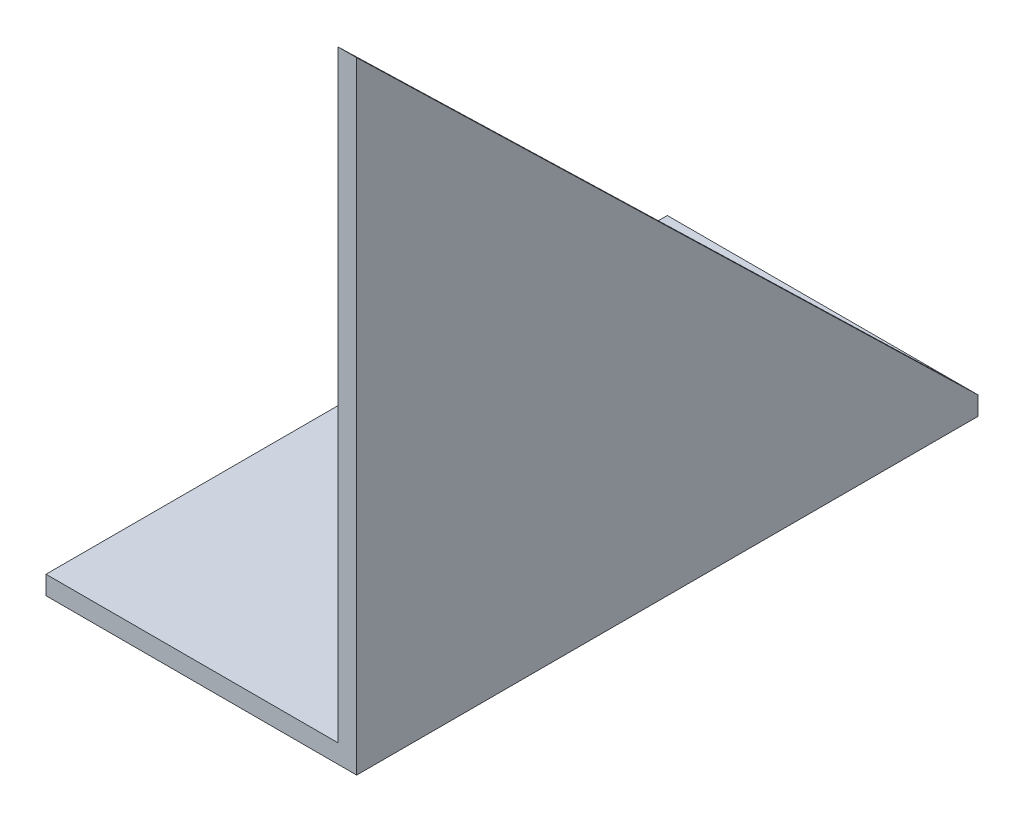
ISO-10303-21;
HEADER;
FILE_DESCRIPTION(('STEP AP214'),'2;1');
FILE_NAME('part.step','',(''),(''),'','','');
FILE_SCHEMA(('AUTOMOTIVE_DESIGN { 1 0 10303 214 1 1 1 1 }'));
ENDSEC;
DATA;
#1=APPLICATION_CONTEXT('core data for automotive mechanical design processes');
#2=APPLICATION_PROTOCOL_DEFINITION('international standard','automotive_design',2000,#1);
#3=PRODUCT_CONTEXT('',#1,'mechanical');
#4=PRODUCT('Part','Part','',(#3));
#5=PRODUCT_RELATED_PRODUCT_CATEGORY('part','',(#4));
#6=PRODUCT_DEFINITION_FORMATION('','',#4);
#7=PRODUCT_DEFINITION_CONTEXT('part definition',#1,'design');
#8=PRODUCT_DEFINITION('design','',#6,#7);
#9=PRODUCT_DEFINITION_SHAPE('','',#8);
#10=(LENGTH_UNIT() NAMED_UNIT(*) SI_UNIT(.MILLI.,.METRE.));
#11=(NAMED_UNIT(*) PLANE_ANGLE_UNIT() SI_UNIT($,.RADIAN.));
#12=(NAMED_UNIT(*) SI_UNIT($,.STERADIAN.) SOLID_ANGLE_UNIT());
#13=UNCERTAINTY_MEASURE_WITH_UNIT(LENGTH_MEASURE(1.E-05),#10,'distance_accuracy_value','');
#14=(GEOMETRIC_REPRESENTATION_CONTEXT(3) GLOBAL_UNCERTAINTY_ASSIGNED_CONTEXT((#13)) GLOBAL_UNIT_ASSIGNED_CONTEXT((#10,
#11,#12)) REPRESENTATION_CONTEXT('',''));
#15=CARTESIAN_POINT('',(0.,0.,0.));
#16=DIRECTION('',(0.,0.,1.));
#17=DIRECTION('',(1.,0.,0.));
#18=AXIS2_PLACEMENT_3D('',#15,#16,#17);
#19=CARTESIAN_POINT('',(-1.5,0.,50.));
#20=DIRECTION('',(-1.,0.,0.));
#21=DIRECTION('',(0.,0.,1.));
#22=AXIS2_PLACEMENT_3D('',#19,#20,#21);
#23=PLANE('',#22);
#24=DIRECTION('',(0.,1.,0.));
#25=VECTOR('',#24,1.);
#26=CARTESIAN_POINT('',(-1.5,0.,50.));
#27=LINE('',#26,#25);
#28=CARTESIAN_POINT('',(-1.5,-46.9999999999999,50.));
#29=VERTEX_POINT('',#28);
#30=CARTESIAN_POINT('',(-1.5,50.0000000000001,50.));
#31=VERTEX_POINT('',#30);
#32=EDGE_CURVE('E150',#29,#31,#27,.T.);
#33=ORIENTED_EDGE('',*,*,#32,.T.);
#34=DIRECTION('',(0.,-0.696257929457928,-0.717791679853534));
#35=VECTOR('',#34,1.);
#36=CARTESIAN_POINT('',(-1.5,0.772837343500488,-0.749652223195473));
#37=LINE('',#36,#35);
#38=CARTESIAN_POINT('',(-1.5,-46.9999999999999,-50.));
#39=VERTEX_POINT('',#38);
#40=EDGE_CURVE('E156',#31,#39,#37,.T.);
#41=ORIENTED_EDGE('',*,*,#40,.T.);
#42=DIRECTION('',(0.,0.,-1.));
#43=VECTOR('',#42,1.);
#44=CARTESIAN_POINT('',(-1.5,-46.9999999999999,50.));
#45=LINE('',#44,#43);
#46=EDGE_CURVE('E67',#29,#39,#45,.T.);
#47=ORIENTED_EDGE('',*,*,#46,.F.);
#48=EDGE_LOOP('',(#33,#41,#47));
#49=FACE_BOUND('',#48,.T.);
#50=ADVANCED_FACE('F59',(#49),#23,.T.);
#51=CARTESIAN_POINT('',(1.5,0.,50.));
#52=DIRECTION('',(-1.,0.,0.));
#53=DIRECTION('',(0.,0.,1.));
#54=AXIS2_PLACEMENT_3D('',#51,#52,#53);
#55=PLANE('',#54);
#56=DIRECTION('',(0.,-0.696257929457928,-0.717791679853534));
#57=VECTOR('',#56,1.);
#58=CARTESIAN_POINT('',(1.5,25.761244783348,25.0115925601525));
#59=LINE('',#58,#57);
#60=CARTESIAN_POINT('',(1.5,50.0000000000001,50.));
#61=VERTEX_POINT('',#60);
#62=CARTESIAN_POINT('',(1.5,-46.9999999999999,-50.));
#63=VERTEX_POINT('',#62);
#64=EDGE_CURVE('E73',#61,#63,#59,.T.);
#65=ORIENTED_EDGE('',*,*,#64,.F.);
#66=DIRECTION('',(0.,1.,0.));
#67=VECTOR('',#66,1.);
#68=CARTESIAN_POINT('',(1.5,0.,50.));
#69=LINE('',#68,#67);
#70=CARTESIAN_POINT('',(1.5,-49.9999999999999,50.));
#71=VERTEX_POINT('',#70);
#72=EDGE_CURVE('E143',#71,#61,#69,.T.);
#73=ORIENTED_EDGE('',*,*,#72,.F.);
#74=DIRECTION('',(0.,0.,-1.));
#75=VECTOR('',#74,1.);
#76=CARTESIAN_POINT('',(1.5,-49.9999999999999,50.));
#77=LINE('',#76,#75);
#78=CARTESIAN_POINT('',(1.5,-49.9999999999999,-50.));
#79=VERTEX_POINT('',#78);
#80=EDGE_CURVE('E134',#71,#79,#77,.T.);
#81=ORIENTED_EDGE('',*,*,#80,.T.);
#82=DIRECTION('',(0.,1.,0.));
#83=VECTOR('',#82,1.);
#84=CARTESIAN_POINT('',(1.5,0.,-50.));
#85=LINE('',#84,#83);
#86=EDGE_CURVE('E110',#79,#63,#85,.T.);
#87=ORIENTED_EDGE('',*,*,#86,.T.);
#88=EDGE_LOOP('',(#65,#73,#81,#87));
#89=FACE_BOUND('',#88,.T.);
#90=ADVANCED_FACE('F163',(#89),#55,.F.);
#91=CARTESIAN_POINT('',(0.,0.,-50.));
#92=DIRECTION('',(0.,0.,1.));
#93=DIRECTION('',(1.,0.,0.));
#94=AXIS2_PLACEMENT_3D('',#91,#92,#93);
#95=PLANE('',#94);
#96=DIRECTION('',(-1.,0.,0.));
#97=VECTOR('',#96,1.);
#98=CARTESIAN_POINT('',(0.,-46.9999999999999,-50.));
#99=LINE('',#98,#97);
#100=EDGE_CURVE('E12',#63,#39,#99,.T.);
#101=ORIENTED_EDGE('',*,*,#100,.F.);
#102=ORIENTED_EDGE('',*,*,#86,.F.);
#103=DIRECTION('',(-1.,0.,0.));
#104=VECTOR('',#103,1.);
#105=CARTESIAN_POINT('',(0.,-49.9999999999999,-50.));
#106=LINE('',#105,#104);
#107=CARTESIAN_POINT('',(-48.5,-49.9999999999999,-50.));
#108=VERTEX_POINT('',#107);
#109=EDGE_CURVE('E103',#79,#108,#106,.T.);
#110=ORIENTED_EDGE('',*,*,#109,.T.);
#111=DIRECTION('',(0.,1.,0.));
#112=VECTOR('',#111,1.);
#113=CARTESIAN_POINT('',(-48.5,-49.9999999999999,-50.));
#114=LINE('',#113,#112);
#115=CARTESIAN_POINT('',(-48.5,-46.9999999999999,-50.));
#116=VERTEX_POINT('',#115);
#117=EDGE_CURVE('E108',#108,#116,#114,.T.);
#118=ORIENTED_EDGE('',*,*,#117,.T.);
#119=DIRECTION('',(-1.,0.,0.));
#120=VECTOR('',#119,1.);
#121=CARTESIAN_POINT('',(-1.5,-46.9999999999999,-50.));
#122=LINE('',#121,#120);
#123=EDGE_CURVE('E128',#39,#116,#122,.T.);
#124=ORIENTED_EDGE('',*,*,#123,.F.);
#125=EDGE_LOOP('',(#101,#102,#110,#118,#124));
#126=FACE_BOUND('',#125,.T.);
#127=ADVANCED_FACE('F105',(#126),#95,.F.);
#128=CARTESIAN_POINT('',(0.,-49.9999999999999,50.));
#129=DIRECTION('',(0.,-1.,0.));
#130=DIRECTION('',(0.,0.,-1.));
#131=AXIS2_PLACEMENT_3D('',#128,#129,#130);
#132=PLANE('',#131);
#133=ORIENTED_EDGE('',*,*,#109,.F.);
#134=ORIENTED_EDGE('',*,*,#80,.F.);
#135=DIRECTION('',(-1.,0.,0.));
#136=VECTOR('',#135,1.);
#137=CARTESIAN_POINT('',(0.,-49.9999999999999,50.));
#138=LINE('',#137,#136);
#139=CARTESIAN_POINT('',(-48.5,-49.9999999999999,50.));
#140=VERTEX_POINT('',#139);
#141=EDGE_CURVE('E118',#71,#140,#138,.T.);
#142=ORIENTED_EDGE('',*,*,#141,.T.);
#143=DIRECTION('',(0.,0.,-1.));
#144=VECTOR('',#143,1.);
#145=CARTESIAN_POINT('',(-48.5,-49.9999999999999,50.));
#146=LINE('',#145,#144);
#147=EDGE_CURVE('E115',#140,#108,#146,.T.);
#148=ORIENTED_EDGE('',*,*,#147,.T.);
#149=EDGE_LOOP('',(#133,#134,#142,#148));
#150=FACE_BOUND('',#149,.T.);
#151=ADVANCED_FACE('F116',(#150),#132,.T.);
#152=CARTESIAN_POINT('',(0.,0.,50.));
#153=DIRECTION('',(0.,0.,1.));
#154=DIRECTION('',(1.,0.,0.));
#155=AXIS2_PLACEMENT_3D('',#152,#153,#154);
#156=PLANE('',#155);
#157=ORIENTED_EDGE('',*,*,#32,.F.);
#158=DIRECTION('',(-1.,0.,0.));
#159=VECTOR('',#158,1.);
#160=CARTESIAN_POINT('',(-1.5,-46.9999999999999,50.));
#161=LINE('',#160,#159);
#162=CARTESIAN_POINT('',(-48.5,-46.9999999999999,50.));
#163=VERTEX_POINT('',#162);
#164=EDGE_CURVE('E127',#29,#163,#161,.T.);
#165=ORIENTED_EDGE('',*,*,#164,.T.);
#166=DIRECTION('',(0.,1.,0.));
#167=VECTOR('',#166,1.);
#168=CARTESIAN_POINT('',(-48.5,-49.9999999999999,50.));
#169=LINE('',#168,#167);
#170=EDGE_CURVE('E122',#140,#163,#169,.T.);
#171=ORIENTED_EDGE('',*,*,#170,.F.);
#172=ORIENTED_EDGE('',*,*,#141,.F.);
#173=ORIENTED_EDGE('',*,*,#72,.T.);
#174=DIRECTION('',(-1.,0.,0.));
#175=VECTOR('',#174,1.);
#176=CARTESIAN_POINT('',(0.,50.0000000000001,50.));
#177=LINE('',#176,#175);
#178=EDGE_CURVE('E138',#61,#31,#177,.T.);
#179=ORIENTED_EDGE('',*,*,#178,.T.);
#180=EDGE_LOOP('',(#157,#165,#171,#172,#173,#179));
#181=FACE_BOUND('',#180,.T.);
#182=ADVANCED_FACE('F148',(#181),#156,.T.);
#183=CARTESIAN_POINT('',(-48.5,-49.9999999999999,50.));
#184=DIRECTION('',(-1.,0.,0.));
#185=DIRECTION('',(0.,0.,1.));
#186=AXIS2_PLACEMENT_3D('',#183,#184,#185);
#187=PLANE('',#186);
#188=ORIENTED_EDGE('',*,*,#117,.F.);
#189=ORIENTED_EDGE('',*,*,#147,.F.);
#190=ORIENTED_EDGE('',*,*,#170,.T.);
#191=DIRECTION('',(0.,0.,-1.));
#192=VECTOR('',#191,1.);
#193=CARTESIAN_POINT('',(-48.5,-46.9999999999999,50.));
#194=LINE('',#193,#192);
#195=EDGE_CURVE('E112',#163,#116,#194,.T.);
#196=ORIENTED_EDGE('',*,*,#195,.T.);
#197=EDGE_LOOP('',(#188,#189,#190,#196));
#198=FACE_BOUND('',#197,.T.);
#199=ADVANCED_FACE('F124',(#198),#187,.T.);
#200=CARTESIAN_POINT('',(-1.5,-46.9999999999999,50.));
#201=DIRECTION('',(0.,-1.,0.));
#202=DIRECTION('',(1.,0.,0.));
#203=AXIS2_PLACEMENT_3D('',#200,#201,#202);
#204=PLANE('',#203);
#205=ORIENTED_EDGE('',*,*,#123,.T.);
#206=ORIENTED_EDGE('',*,*,#195,.F.);
#207=ORIENTED_EDGE('',*,*,#164,.F.);
#208=ORIENTED_EDGE('',*,*,#46,.T.);
#209=EDGE_LOOP('',(#205,#206,#207,#208));
#210=FACE_BOUND('',#209,.T.);
#211=ADVANCED_FACE('F61',(#210),#204,.F.);
#212=CARTESIAN_POINT('',(98.5,0.772837343500488,-0.749652223195473));
#213=DIRECTION('',(0.,0.717791679853534,-0.696257929457928));
#214=DIRECTION('',(0.,0.696257929457928,0.717791679853534));
#215=AXIS2_PLACEMENT_3D('',#212,#213,#214);
#216=PLANE('',#215);
#217=ORIENTED_EDGE('',*,*,#64,.T.);
#218=ORIENTED_EDGE('',*,*,#100,.T.);
#219=ORIENTED_EDGE('',*,*,#40,.F.);
#220=ORIENTED_EDGE('',*,*,#178,.F.);
#221=EDGE_LOOP('',(#217,#218,#219,#220));
#222=FACE_BOUND('',#221,.T.);
#223=ADVANCED_FACE('F157',(#222),#216,.T.);
#224=CLOSED_SHELL('',(#50,#90,#127,#151,#182,#199,#211,#223));
#225=MANIFOLD_SOLID_BREP('B2',#224);
#226=ADVANCED_BREP_SHAPE_REPRESENTATION('',(#18,#225),#14);
#227=SHAPE_DEFINITION_REPRESENTATION(#9,#226);
ENDSEC;
END-ISO-10303-21;
